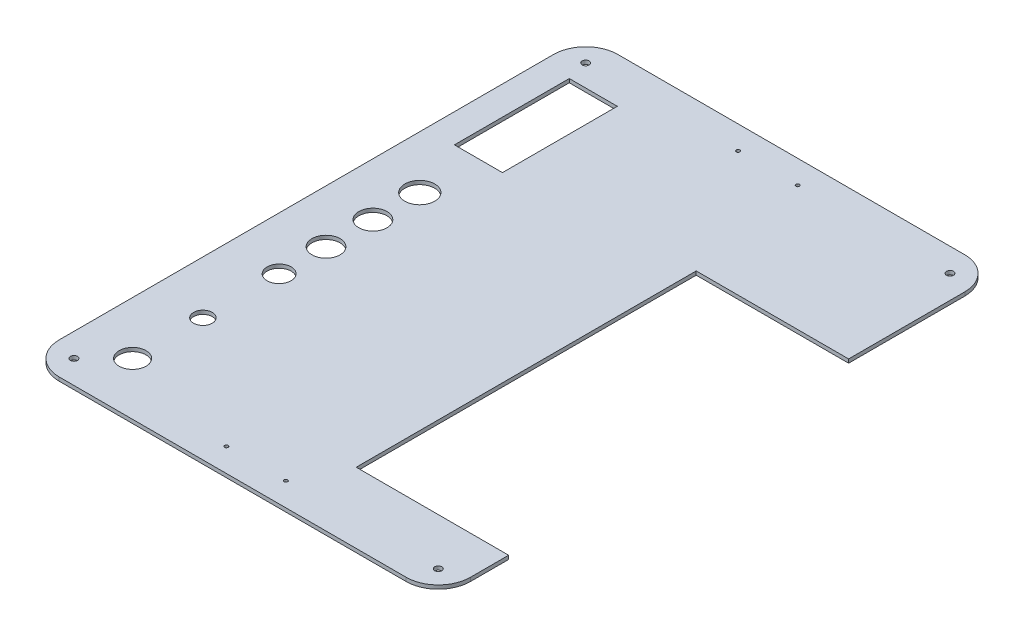
ISO-10303-21;
HEADER;
FILE_DESCRIPTION(('STEP AP214'),'2;1');
FILE_NAME('part.step','',(''),(''),'','','');
FILE_SCHEMA(('AUTOMOTIVE_DESIGN { 1 0 10303 214 1 1 1 1 }'));
ENDSEC;
DATA;
#1=APPLICATION_CONTEXT('core data for automotive mechanical design processes');
#2=APPLICATION_PROTOCOL_DEFINITION('international standard','automotive_design',2000,#1);
#3=PRODUCT_CONTEXT('',#1,'mechanical');
#4=PRODUCT('Part','Part','',(#3));
#5=PRODUCT_RELATED_PRODUCT_CATEGORY('part','',(#4));
#6=PRODUCT_DEFINITION_FORMATION('','',#4);
#7=PRODUCT_DEFINITION_CONTEXT('part definition',#1,'design');
#8=PRODUCT_DEFINITION('design','',#6,#7);
#9=PRODUCT_DEFINITION_SHAPE('','',#8);
#10=(LENGTH_UNIT() NAMED_UNIT(*) SI_UNIT(.MILLI.,.METRE.));
#11=(NAMED_UNIT(*) PLANE_ANGLE_UNIT() SI_UNIT($,.RADIAN.));
#12=(NAMED_UNIT(*) SI_UNIT($,.STERADIAN.) SOLID_ANGLE_UNIT());
#13=UNCERTAINTY_MEASURE_WITH_UNIT(LENGTH_MEASURE(1.E-05),#10,'distance_accuracy_value','');
#14=(GEOMETRIC_REPRESENTATION_CONTEXT(3) GLOBAL_UNCERTAINTY_ASSIGNED_CONTEXT((#13)) GLOBAL_UNIT_ASSIGNED_CONTEXT((#10,
#11,#12)) REPRESENTATION_CONTEXT('',''));
#15=CARTESIAN_POINT('',(0.,0.,0.));
#16=DIRECTION('',(0.,0.,1.));
#17=DIRECTION('',(1.,0.,0.));
#18=AXIS2_PLACEMENT_3D('',#15,#16,#17);
#19=CARTESIAN_POINT('',(175.387,3.175,-210.82));
#20=DIRECTION('',(-1.,0.,0.));
#21=DIRECTION('',(0.,0.,1.));
#22=AXIS2_PLACEMENT_3D('',#19,#20,#21);
#23=PLANE('',#22);
#24=DIRECTION('',(0.,0.,-1.));
#25=VECTOR('',#24,1.);
#26=CARTESIAN_POINT('',(175.387,0.,-210.82));
#27=LINE('',#26,#25);
#28=CARTESIAN_POINT('',(175.387,0.,210.82));
#29=VERTEX_POINT('',#28);
#30=CARTESIAN_POINT('',(175.387,0.,178.252));
#31=VERTEX_POINT('',#30);
#32=EDGE_CURVE('E280',#29,#31,#27,.T.);
#33=ORIENTED_EDGE('',*,*,#32,.T.);
#34=DIRECTION('',(0.,1.,0.));
#35=VECTOR('',#34,1.);
#36=CARTESIAN_POINT('',(175.387,-6.825,178.252));
#37=LINE('',#36,#35);
#38=CARTESIAN_POINT('',(175.387,3.175,178.252));
#39=VERTEX_POINT('',#38);
#40=EDGE_CURVE('E242',#31,#39,#37,.T.);
#41=ORIENTED_EDGE('',*,*,#40,.T.);
#42=DIRECTION('',(0.,0.,-1.));
#43=VECTOR('',#42,1.);
#44=CARTESIAN_POINT('',(175.387,3.175,-210.82));
#45=LINE('',#44,#43);
#46=CARTESIAN_POINT('',(175.387,3.175,210.82));
#47=VERTEX_POINT('',#46);
#48=EDGE_CURVE('E256',#47,#39,#45,.T.);
#49=ORIENTED_EDGE('',*,*,#48,.F.);
#50=DIRECTION('',(0.,-1.,0.));
#51=VECTOR('',#50,1.);
#52=CARTESIAN_POINT('',(175.387,3.175,210.82));
#53=LINE('',#52,#51);
#54=EDGE_CURVE('E313',#47,#29,#53,.T.);
#55=ORIENTED_EDGE('',*,*,#54,.T.);
#56=EDGE_LOOP('',(#33,#41,#49,#55));
#57=FACE_BOUND('',#56,.T.);
#58=ADVANCED_FACE('F39',(#57),#23,.F.);
#59=CARTESIAN_POINT('',(147.955,3.175,210.82));
#60=DIRECTION('',(0.,-1.,0.));
#61=DIRECTION('',(0.,0.,-1.));
#62=AXIS2_PLACEMENT_3D('',#59,#60,#61);
#63=CYLINDRICAL_SURFACE('',#62,27.432);
#64=CARTESIAN_POINT('',(147.955,0.,210.82));
#65=DIRECTION('',(0.,1.,0.));
#66=DIRECTION('',(0.,0.,1.));
#67=AXIS2_PLACEMENT_3D('',#64,#65,#66);
#68=CIRCLE('',#67,27.432);
#69=CARTESIAN_POINT('',(147.955,0.,238.252));
#70=VERTEX_POINT('',#69);
#71=EDGE_CURVE('E250',#70,#29,#68,.T.);
#72=ORIENTED_EDGE('',*,*,#71,.T.);
#73=ORIENTED_EDGE('',*,*,#54,.F.);
#74=CARTESIAN_POINT('',(147.955,3.175,210.82));
#75=DIRECTION('',(0.,1.,0.));
#76=DIRECTION('',(0.,0.,1.));
#77=AXIS2_PLACEMENT_3D('',#74,#75,#76);
#78=CIRCLE('',#77,27.432);
#79=CARTESIAN_POINT('',(147.955,3.175,238.252));
#80=VERTEX_POINT('',#79);
#81=EDGE_CURVE('E251',#80,#47,#78,.T.);
#82=ORIENTED_EDGE('',*,*,#81,.F.);
#83=DIRECTION('',(0.,-1.,0.));
#84=VECTOR('',#83,1.);
#85=CARTESIAN_POINT('',(147.955,3.175,238.252));
#86=LINE('',#85,#84);
#87=EDGE_CURVE('E272',#80,#70,#86,.T.);
#88=ORIENTED_EDGE('',*,*,#87,.T.);
#89=EDGE_LOOP('',(#72,#73,#82,#88));
#90=FACE_BOUND('',#89,.T.);
#91=ADVANCED_FACE('F41',(#90),#63,.T.);
#92=CARTESIAN_POINT('',(175.387,3.175,-111.748));
#93=VERTEX_POINT('',#92);
#94=CARTESIAN_POINT('',(175.387,3.175,-210.82));
#95=VERTEX_POINT('',#94);
#96=EDGE_CURVE('E258',#93,#95,#45,.T.);
#97=ORIENTED_EDGE('',*,*,#96,.F.);
#98=DIRECTION('',(0.,1.,0.));
#99=VECTOR('',#98,1.);
#100=CARTESIAN_POINT('',(175.387,-6.825,-111.748));
#101=LINE('',#100,#99);
#102=CARTESIAN_POINT('',(175.387,0.,-111.748));
#103=VERTEX_POINT('',#102);
#104=EDGE_CURVE('E241',#103,#93,#101,.T.);
#105=ORIENTED_EDGE('',*,*,#104,.F.);
#106=CARTESIAN_POINT('',(175.387,0.,-210.82));
#107=VERTEX_POINT('',#106);
#108=EDGE_CURVE('E277',#103,#107,#27,.T.);
#109=ORIENTED_EDGE('',*,*,#108,.T.);
#110=DIRECTION('',(0.,-1.,0.));
#111=VECTOR('',#110,1.);
#112=CARTESIAN_POINT('',(175.387,3.175,-210.82));
#113=LINE('',#112,#111);
#114=EDGE_CURVE('E306',#95,#107,#113,.T.);
#115=ORIENTED_EDGE('',*,*,#114,.F.);
#116=EDGE_LOOP('',(#97,#105,#109,#115));
#117=FACE_BOUND('',#116,.T.);
#118=ADVANCED_FACE('F366',(#117),#23,.F.);
#119=CARTESIAN_POINT('',(147.955,3.175,-210.82));
#120=DIRECTION('',(0.,-1.,0.));
#121=DIRECTION('',(0.,0.,-1.));
#122=AXIS2_PLACEMENT_3D('',#119,#120,#121);
#123=CYLINDRICAL_SURFACE('',#122,27.432);
#124=CARTESIAN_POINT('',(147.955,0.,-210.82));
#125=DIRECTION('',(0.,1.,0.));
#126=DIRECTION('',(0.,0.,-1.));
#127=AXIS2_PLACEMENT_3D('',#124,#125,#126);
#128=CIRCLE('',#127,27.432);
#129=CARTESIAN_POINT('',(147.955,0.,-238.252));
#130=VERTEX_POINT('',#129);
#131=EDGE_CURVE('E278',#107,#130,#128,.T.);
#132=ORIENTED_EDGE('',*,*,#131,.T.);
#133=DIRECTION('',(0.,-1.,0.));
#134=VECTOR('',#133,1.);
#135=CARTESIAN_POINT('',(147.955,3.175,-238.252));
#136=LINE('',#135,#134);
#137=CARTESIAN_POINT('',(147.955,3.175,-238.252));
#138=VERTEX_POINT('',#137);
#139=EDGE_CURVE('E304',#138,#130,#136,.T.);
#140=ORIENTED_EDGE('',*,*,#139,.F.);
#141=CARTESIAN_POINT('',(147.955,3.175,-210.82));
#142=DIRECTION('',(0.,1.,0.));
#143=DIRECTION('',(0.,0.,-1.));
#144=AXIS2_PLACEMENT_3D('',#141,#142,#143);
#145=CIRCLE('',#144,27.432);
#146=EDGE_CURVE('E261',#95,#138,#145,.T.);
#147=ORIENTED_EDGE('',*,*,#146,.F.);
#148=ORIENTED_EDGE('',*,*,#114,.T.);
#149=EDGE_LOOP('',(#132,#140,#147,#148));
#150=FACE_BOUND('',#149,.T.);
#151=ADVANCED_FACE('F361',(#150),#123,.T.);
#152=CARTESIAN_POINT('',(-147.955,3.175,-238.252));
#153=DIRECTION('',(0.,0.,1.));
#154=DIRECTION('',(1.,0.,0.));
#155=AXIS2_PLACEMENT_3D('',#152,#153,#154);
#156=PLANE('',#155);
#157=DIRECTION('',(-1.,0.,0.));
#158=VECTOR('',#157,1.);
#159=CARTESIAN_POINT('',(-147.955,0.,-238.252));
#160=LINE('',#159,#158);
#161=CARTESIAN_POINT('',(-147.955,0.,-238.252));
#162=VERTEX_POINT('',#161);
#163=EDGE_CURVE('E285',#130,#162,#160,.T.);
#164=ORIENTED_EDGE('',*,*,#163,.T.);
#165=DIRECTION('',(0.,-1.,0.));
#166=VECTOR('',#165,1.);
#167=CARTESIAN_POINT('',(-147.955,3.175,-238.252));
#168=LINE('',#167,#166);
#169=CARTESIAN_POINT('',(-147.955,3.175,-238.252));
#170=VERTEX_POINT('',#169);
#171=EDGE_CURVE('E305',#170,#162,#168,.T.);
#172=ORIENTED_EDGE('',*,*,#171,.F.);
#173=DIRECTION('',(-1.,0.,0.));
#174=VECTOR('',#173,1.);
#175=CARTESIAN_POINT('',(-147.955,3.175,-238.252));
#176=LINE('',#175,#174);
#177=EDGE_CURVE('E263',#138,#170,#176,.T.);
#178=ORIENTED_EDGE('',*,*,#177,.F.);
#179=ORIENTED_EDGE('',*,*,#139,.T.);
#180=EDGE_LOOP('',(#164,#172,#178,#179));
#181=FACE_BOUND('',#180,.T.);
#182=ADVANCED_FACE('F358',(#181),#156,.F.);
#183=CARTESIAN_POINT('',(-147.955,3.175,-210.82));
#184=DIRECTION('',(0.,-1.,0.));
#185=DIRECTION('',(0.,0.,-1.));
#186=AXIS2_PLACEMENT_3D('',#183,#184,#185);
#187=CYLINDRICAL_SURFACE('',#186,27.432);
#188=CARTESIAN_POINT('',(-147.955,0.,-210.82));
#189=DIRECTION('',(0.,1.,0.));
#190=DIRECTION('',(0.,0.,1.));
#191=AXIS2_PLACEMENT_3D('',#188,#189,#190);
#192=CIRCLE('',#191,27.432);
#193=CARTESIAN_POINT('',(-175.387,0.,-210.82));
#194=VERTEX_POINT('',#193);
#195=EDGE_CURVE('E282',#162,#194,#192,.T.);
#196=ORIENTED_EDGE('',*,*,#195,.T.);
#197=DIRECTION('',(0.,-1.,0.));
#198=VECTOR('',#197,1.);
#199=CARTESIAN_POINT('',(-175.387,3.175,-210.82));
#200=LINE('',#199,#198);
#201=CARTESIAN_POINT('',(-175.387,3.175,-210.82));
#202=VERTEX_POINT('',#201);
#203=EDGE_CURVE('E297',#202,#194,#200,.T.);
#204=ORIENTED_EDGE('',*,*,#203,.F.);
#205=CARTESIAN_POINT('',(-147.955,3.175,-210.82));
#206=DIRECTION('',(0.,1.,0.));
#207=DIRECTION('',(0.,0.,1.));
#208=AXIS2_PLACEMENT_3D('',#205,#206,#207);
#209=CIRCLE('',#208,27.432);
#210=EDGE_CURVE('E264',#170,#202,#209,.T.);
#211=ORIENTED_EDGE('',*,*,#210,.F.);
#212=ORIENTED_EDGE('',*,*,#171,.T.);
#213=EDGE_LOOP('',(#196,#204,#211,#212));
#214=FACE_BOUND('',#213,.T.);
#215=ADVANCED_FACE('F352',(#214),#187,.T.);
#216=CARTESIAN_POINT('',(-175.387,3.175,-210.82));
#217=DIRECTION('',(1.,0.,0.));
#218=DIRECTION('',(0.,0.,-1.));
#219=AXIS2_PLACEMENT_3D('',#216,#217,#218);
#220=PLANE('',#219);
#221=DIRECTION('',(0.,0.,1.));
#222=VECTOR('',#221,1.);
#223=CARTESIAN_POINT('',(-175.387,0.,-210.82));
#224=LINE('',#223,#222);
#225=CARTESIAN_POINT('',(-175.387,0.,210.82));
#226=VERTEX_POINT('',#225);
#227=EDGE_CURVE('E286',#194,#226,#224,.T.);
#228=ORIENTED_EDGE('',*,*,#227,.T.);
#229=DIRECTION('',(0.,-1.,0.));
#230=VECTOR('',#229,1.);
#231=CARTESIAN_POINT('',(-175.387,3.175,210.82));
#232=LINE('',#231,#230);
#233=CARTESIAN_POINT('',(-175.387,3.175,210.82));
#234=VERTEX_POINT('',#233);
#235=EDGE_CURVE('E298',#234,#226,#232,.T.);
#236=ORIENTED_EDGE('',*,*,#235,.F.);
#237=DIRECTION('',(0.,0.,1.));
#238=VECTOR('',#237,1.);
#239=CARTESIAN_POINT('',(-175.387,3.175,-210.82));
#240=LINE('',#239,#238);
#241=EDGE_CURVE('E270',#202,#234,#240,.T.);
#242=ORIENTED_EDGE('',*,*,#241,.F.);
#243=ORIENTED_EDGE('',*,*,#203,.T.);
#244=EDGE_LOOP('',(#228,#236,#242,#243));
#245=FACE_BOUND('',#244,.T.);
#246=ADVANCED_FACE('F346',(#245),#220,.F.);
#247=CARTESIAN_POINT('',(-147.955,3.175,210.82));
#248=DIRECTION('',(0.,-1.,0.));
#249=DIRECTION('',(0.,0.,-1.));
#250=AXIS2_PLACEMENT_3D('',#247,#248,#249);
#251=CYLINDRICAL_SURFACE('',#250,27.432);
#252=CARTESIAN_POINT('',(-147.955,0.,210.82));
#253=DIRECTION('',(0.,1.,0.));
#254=DIRECTION('',(0.,0.,1.));
#255=AXIS2_PLACEMENT_3D('',#252,#253,#254);
#256=CIRCLE('',#255,27.432);
#257=CARTESIAN_POINT('',(-147.955,0.,238.252));
#258=VERTEX_POINT('',#257);
#259=EDGE_CURVE('E287',#226,#258,#256,.T.);
#260=ORIENTED_EDGE('',*,*,#259,.T.);
#261=DIRECTION('',(0.,-1.,0.));
#262=VECTOR('',#261,1.);
#263=CARTESIAN_POINT('',(-147.955,3.175,238.252));
#264=LINE('',#263,#262);
#265=CARTESIAN_POINT('',(-147.955,3.175,238.252));
#266=VERTEX_POINT('',#265);
#267=EDGE_CURVE('E291',#266,#258,#264,.T.);
#268=ORIENTED_EDGE('',*,*,#267,.F.);
#269=CARTESIAN_POINT('',(-147.955,3.175,210.82));
#270=DIRECTION('',(0.,1.,0.));
#271=DIRECTION('',(0.,0.,1.));
#272=AXIS2_PLACEMENT_3D('',#269,#270,#271);
#273=CIRCLE('',#272,27.432);
#274=EDGE_CURVE('E267',#234,#266,#273,.T.);
#275=ORIENTED_EDGE('',*,*,#274,.F.);
#276=ORIENTED_EDGE('',*,*,#235,.T.);
#277=EDGE_LOOP('',(#260,#268,#275,#276));
#278=FACE_BOUND('',#277,.T.);
#279=ADVANCED_FACE('F343',(#278),#251,.T.);
#280=CARTESIAN_POINT('',(-147.955,3.175,238.252));
#281=DIRECTION('',(0.,0.,-1.));
#282=DIRECTION('',(-1.,0.,0.));
#283=AXIS2_PLACEMENT_3D('',#280,#281,#282);
#284=PLANE('',#283);
#285=DIRECTION('',(1.,0.,0.));
#286=VECTOR('',#285,1.);
#287=CARTESIAN_POINT('',(-147.955,0.,238.252));
#288=LINE('',#287,#286);
#289=EDGE_CURVE('E260',#258,#70,#288,.T.);
#290=ORIENTED_EDGE('',*,*,#289,.T.);
#291=ORIENTED_EDGE('',*,*,#87,.F.);
#292=DIRECTION('',(1.,0.,0.));
#293=VECTOR('',#292,1.);
#294=CARTESIAN_POINT('',(-147.955,3.175,238.252));
#295=LINE('',#294,#293);
#296=EDGE_CURVE('E271',#266,#80,#295,.T.);
#297=ORIENTED_EDGE('',*,*,#296,.F.);
#298=ORIENTED_EDGE('',*,*,#267,.T.);
#299=EDGE_LOOP('',(#290,#291,#297,#298));
#300=FACE_BOUND('',#299,.T.);
#301=ADVANCED_FACE('F339',(#300),#284,.F.);
#302=CARTESIAN_POINT('',(147.955,3.175,210.82));
#303=DIRECTION('',(0.,1.,0.));
#304=DIRECTION('',(0.,0.,1.));
#305=AXIS2_PLACEMENT_3D('',#302,#303,#304);
#306=PLANE('',#305);
#307=CARTESIAN_POINT('',(155.387,3.175,218.252));
#308=DIRECTION('',(0.,1.,0.));
#309=DIRECTION('',(0.,0.,1.));
#310=AXIS2_PLACEMENT_3D('',#307,#308,#309);
#311=CIRCLE('',#310,2.99999999999999);
#312=CARTESIAN_POINT('',(155.387,3.175,221.252));
#313=VERTEX_POINT('',#312);
#314=EDGE_CURVE('E199',#313,#313,#311,.T.);
#315=ORIENTED_EDGE('',*,*,#314,.F.);
#316=EDGE_LOOP('',(#315));
#317=FACE_BOUND('',#316,.T.);
#318=CARTESIAN_POINT('',(155.387,3.175,-218.252));
#319=DIRECTION('',(0.,1.,0.));
#320=DIRECTION('',(0.,0.,1.));
#321=AXIS2_PLACEMENT_3D('',#318,#319,#320);
#322=CIRCLE('',#321,2.99999999999999);
#323=CARTESIAN_POINT('',(155.387,3.175,-215.252));
#324=VERTEX_POINT('',#323);
#325=EDGE_CURVE('E193',#324,#324,#322,.T.);
#326=ORIENTED_EDGE('',*,*,#325,.F.);
#327=EDGE_LOOP('',(#326));
#328=FACE_BOUND('',#327,.T.);
#329=DIRECTION('',(0.,0.,-1.));
#330=VECTOR('',#329,1.);
#331=CARTESIAN_POINT('',(-109.887,3.175,-199.748));
#332=LINE('',#331,#330);
#333=CARTESIAN_POINT('',(-109.887,3.175,-101.748));
#334=VERTEX_POINT('',#333);
#335=CARTESIAN_POINT('',(-109.887,3.175,-199.748));
#336=VERTEX_POINT('',#335);
#337=EDGE_CURVE('E53',#334,#336,#332,.T.);
#338=ORIENTED_EDGE('',*,*,#337,.F.);
#339=DIRECTION('',(1.,0.,0.));
#340=VECTOR('',#339,1.);
#341=CARTESIAN_POINT('',(-150.887,3.175,-101.748));
#342=LINE('',#341,#340);
#343=CARTESIAN_POINT('',(-150.887,3.175,-101.748));
#344=VERTEX_POINT('',#343);
#345=EDGE_CURVE('E168',#344,#334,#342,.T.);
#346=ORIENTED_EDGE('',*,*,#345,.F.);
#347=DIRECTION('',(0.,0.,1.));
#348=VECTOR('',#347,1.);
#349=CARTESIAN_POINT('',(-150.887,3.175,-199.748));
#350=LINE('',#349,#348);
#351=CARTESIAN_POINT('',(-150.887,3.175,-199.748));
#352=VERTEX_POINT('',#351);
#353=EDGE_CURVE('E171',#352,#344,#350,.T.);
#354=ORIENTED_EDGE('',*,*,#353,.F.);
#355=DIRECTION('',(-1.,0.,0.));
#356=VECTOR('',#355,1.);
#357=CARTESIAN_POINT('',(-150.887,3.175,-199.748));
#358=LINE('',#357,#356);
#359=EDGE_CURVE('E185',#336,#352,#358,.T.);
#360=ORIENTED_EDGE('',*,*,#359,.F.);
#361=EDGE_LOOP('',(#338,#346,#354,#360));
#362=FACE_BOUND('',#361,.T.);
#363=CARTESIAN_POINT('',(-130.387,3.175,-51.7479999999999));
#364=DIRECTION('',(0.,1.,0.));
#365=DIRECTION('',(0.,0.,1.));
#366=AXIS2_PLACEMENT_3D('',#363,#364,#365);
#367=CIRCLE('',#366,12.7500000000001);
#368=CARTESIAN_POINT('',(-130.387,3.175,-38.9979999999998));
#369=VERTEX_POINT('',#368);
#370=EDGE_CURVE('E176',#369,#369,#367,.T.);
#371=ORIENTED_EDGE('',*,*,#370,.F.);
#372=EDGE_LOOP('',(#371));
#373=FACE_BOUND('',#372,.T.);
#374=CARTESIAN_POINT('',(-130.387,3.175,-11.7479999999999));
#375=DIRECTION('',(0.,1.,0.));
#376=DIRECTION('',(0.,0.,1.));
#377=AXIS2_PLACEMENT_3D('',#374,#375,#376);
#378=CIRCLE('',#377,12.);
#379=CARTESIAN_POINT('',(-130.387,3.175,0.252000000000101));
#380=VERTEX_POINT('',#379);
#381=EDGE_CURVE('E228',#380,#380,#378,.T.);
#382=ORIENTED_EDGE('',*,*,#381,.F.);
#383=EDGE_LOOP('',(#382));
#384=FACE_BOUND('',#383,.T.);
#385=CARTESIAN_POINT('',(-130.387,3.175,28.2520000000001));
#386=DIRECTION('',(0.,1.,0.));
#387=DIRECTION('',(0.,0.,1.));
#388=AXIS2_PLACEMENT_3D('',#385,#386,#387);
#389=CIRCLE('',#388,12.);
#390=CARTESIAN_POINT('',(-130.387,3.175,40.2520000000001));
#391=VERTEX_POINT('',#390);
#392=EDGE_CURVE('E219',#391,#391,#389,.T.);
#393=ORIENTED_EDGE('',*,*,#392,.F.);
#394=EDGE_LOOP('',(#393));
#395=FACE_BOUND('',#394,.T.);
#396=CARTESIAN_POINT('',(-130.387,3.175,68.2520000000001));
#397=DIRECTION('',(0.,1.,0.));
#398=DIRECTION('',(0.,0.,1.));
#399=AXIS2_PLACEMENT_3D('',#396,#397,#398);
#400=CIRCLE('',#399,10.25);
#401=CARTESIAN_POINT('',(-130.387,3.175,78.5020000000001));
#402=VERTEX_POINT('',#401);
#403=EDGE_CURVE('E212',#402,#402,#400,.T.);
#404=ORIENTED_EDGE('',*,*,#403,.F.);
#405=EDGE_LOOP('',(#404));
#406=FACE_BOUND('',#405,.T.);
#407=CARTESIAN_POINT('',(-130.387,3.175,133.252));
#408=DIRECTION('',(0.,1.,0.));
#409=DIRECTION('',(0.,0.,1.));
#410=AXIS2_PLACEMENT_3D('',#407,#408,#409);
#411=CIRCLE('',#410,7.99999999999999);
#412=CARTESIAN_POINT('',(-130.387,3.175,141.252));
#413=VERTEX_POINT('',#412);
#414=EDGE_CURVE('E208',#413,#413,#411,.T.);
#415=ORIENTED_EDGE('',*,*,#414,.F.);
#416=EDGE_LOOP('',(#415));
#417=FACE_BOUND('',#416,.T.);
#418=CARTESIAN_POINT('',(25.4,3.175,218.252));
#419=DIRECTION('',(0.,1.,0.));
#420=DIRECTION('',(0.,0.,1.));
#421=AXIS2_PLACEMENT_3D('',#418,#419,#420);
#422=CIRCLE('',#421,1.5);
#423=CARTESIAN_POINT('',(25.4,3.175,219.752));
#424=VERTEX_POINT('',#423);
#425=EDGE_CURVE('E433',#424,#424,#422,.T.);
#426=ORIENTED_EDGE('',*,*,#425,.F.);
#427=EDGE_LOOP('',(#426));
#428=FACE_BOUND('',#427,.T.);
#429=CARTESIAN_POINT('',(-25.4,3.175,218.252));
#430=DIRECTION('',(0.,1.,0.));
#431=DIRECTION('',(0.,0.,1.));
#432=AXIS2_PLACEMENT_3D('',#429,#430,#431);
#433=CIRCLE('',#432,1.5);
#434=CARTESIAN_POINT('',(-25.4,3.175,219.752));
#435=VERTEX_POINT('',#434);
#436=EDGE_CURVE('E440',#435,#435,#433,.T.);
#437=ORIENTED_EDGE('',*,*,#436,.F.);
#438=EDGE_LOOP('',(#437));
#439=FACE_BOUND('',#438,.T.);
#440=CARTESIAN_POINT('',(25.4,3.175,-218.252));
#441=DIRECTION('',(0.,1.,0.));
#442=DIRECTION('',(0.,0.,1.));
#443=AXIS2_PLACEMENT_3D('',#440,#441,#442);
#444=CIRCLE('',#443,1.5);
#445=CARTESIAN_POINT('',(25.4,3.175,-216.752));
#446=VERTEX_POINT('',#445);
#447=EDGE_CURVE('E442',#446,#446,#444,.T.);
#448=ORIENTED_EDGE('',*,*,#447,.F.);
#449=EDGE_LOOP('',(#448));
#450=FACE_BOUND('',#449,.T.);
#451=CARTESIAN_POINT('',(-25.4,3.175,-218.252));
#452=DIRECTION('',(0.,1.,0.));
#453=DIRECTION('',(0.,0.,1.));
#454=AXIS2_PLACEMENT_3D('',#451,#452,#453);
#455=CIRCLE('',#454,1.5);
#456=CARTESIAN_POINT('',(-25.4,3.175,-216.752));
#457=VERTEX_POINT('',#456);
#458=EDGE_CURVE('E443',#457,#457,#455,.T.);
#459=ORIENTED_EDGE('',*,*,#458,.F.);
#460=EDGE_LOOP('',(#459));
#461=FACE_BOUND('',#460,.T.);
#462=CARTESIAN_POINT('',(-155.387,3.175,-218.252));
#463=DIRECTION('',(0.,1.,0.));
#464=DIRECTION('',(0.,0.,1.));
#465=AXIS2_PLACEMENT_3D('',#462,#463,#464);
#466=CIRCLE('',#465,2.99999999999999);
#467=CARTESIAN_POINT('',(-155.387,3.175,-215.252));
#468=VERTEX_POINT('',#467);
#469=EDGE_CURVE('E447',#468,#468,#466,.T.);
#470=ORIENTED_EDGE('',*,*,#469,.F.);
#471=EDGE_LOOP('',(#470));
#472=FACE_BOUND('',#471,.T.);
#473=CARTESIAN_POINT('',(-155.387,3.175,218.252));
#474=DIRECTION('',(0.,1.,0.));
#475=DIRECTION('',(0.,0.,1.));
#476=AXIS2_PLACEMENT_3D('',#473,#474,#475);
#477=CIRCLE('',#476,2.99999999999999);
#478=CARTESIAN_POINT('',(-155.387,3.175,221.252));
#479=VERTEX_POINT('',#478);
#480=EDGE_CURVE('E452',#479,#479,#477,.T.);
#481=ORIENTED_EDGE('',*,*,#480,.F.);
#482=EDGE_LOOP('',(#481));
#483=FACE_BOUND('',#482,.T.);
#484=CARTESIAN_POINT('',(-130.387,3.175,193.252));
#485=DIRECTION('',(0.,1.,0.));
#486=DIRECTION('',(0.,0.,1.));
#487=AXIS2_PLACEMENT_3D('',#484,#485,#486);
#488=CIRCLE('',#487,11.5);
#489=CARTESIAN_POINT('',(-130.387,3.175,204.752));
#490=VERTEX_POINT('',#489);
#491=EDGE_CURVE('E210',#490,#490,#488,.T.);
#492=ORIENTED_EDGE('',*,*,#491,.F.);
#493=EDGE_LOOP('',(#492));
#494=FACE_BOUND('',#493,.T.);
#495=DIRECTION('',(1.,0.,0.));
#496=VECTOR('',#495,1.);
#497=CARTESIAN_POINT('',(45.3870000000001,3.175,178.252));
#498=LINE('',#497,#496);
#499=CARTESIAN_POINT('',(45.3870000000001,3.175,178.252));
#500=VERTEX_POINT('',#499);
#501=EDGE_CURVE('E243',#500,#39,#498,.T.);
#502=ORIENTED_EDGE('',*,*,#501,.F.);
#503=DIRECTION('',(0.,0.,1.));
#504=VECTOR('',#503,1.);
#505=CARTESIAN_POINT('',(45.387,3.175,-111.748));
#506=LINE('',#505,#504);
#507=CARTESIAN_POINT('',(45.387,3.175,-111.748));
#508=VERTEX_POINT('',#507);
#509=EDGE_CURVE('E236',#508,#500,#506,.T.);
#510=ORIENTED_EDGE('',*,*,#509,.F.);
#511=DIRECTION('',(-1.,0.,0.));
#512=VECTOR('',#511,1.);
#513=CARTESIAN_POINT('',(175.387,3.175,-111.748));
#514=LINE('',#513,#512);
#515=EDGE_CURVE('E232',#93,#508,#514,.T.);
#516=ORIENTED_EDGE('',*,*,#515,.F.);
#517=ORIENTED_EDGE('',*,*,#96,.T.);
#518=ORIENTED_EDGE('',*,*,#146,.T.);
#519=ORIENTED_EDGE('',*,*,#177,.T.);
#520=ORIENTED_EDGE('',*,*,#210,.T.);
#521=ORIENTED_EDGE('',*,*,#241,.T.);
#522=ORIENTED_EDGE('',*,*,#274,.T.);
#523=ORIENTED_EDGE('',*,*,#296,.T.);
#524=ORIENTED_EDGE('',*,*,#81,.T.);
#525=ORIENTED_EDGE('',*,*,#48,.T.);
#526=EDGE_LOOP('',(#502,#510,#516,#517,#518,#519,#520,#521,#522,#523,#524,#525));
#527=FACE_BOUND('',#526,.T.);
#528=ADVANCED_FACE('F328',(#317,#328,#362,#373,#384,#395,#406,#417,#428,#439,#450,#461,#472,
#483,#494,#527),#306,.T.);
#529=CARTESIAN_POINT('',(147.955,0.,210.82));
#530=DIRECTION('',(0.,1.,0.));
#531=DIRECTION('',(0.,0.,1.));
#532=AXIS2_PLACEMENT_3D('',#529,#530,#531);
#533=PLANE('',#532);
#534=CARTESIAN_POINT('',(155.387,0.,218.252));
#535=DIRECTION('',(0.,1.,0.));
#536=DIRECTION('',(0.,0.,1.));
#537=AXIS2_PLACEMENT_3D('',#534,#535,#536);
#538=CIRCLE('',#537,2.99999999999999);
#539=CARTESIAN_POINT('',(155.387,0.,221.252));
#540=VERTEX_POINT('',#539);
#541=EDGE_CURVE('E197',#540,#540,#538,.T.);
#542=ORIENTED_EDGE('',*,*,#541,.T.);
#543=EDGE_LOOP('',(#542));
#544=FACE_BOUND('',#543,.T.);
#545=CARTESIAN_POINT('',(155.387,0.,-218.252));
#546=DIRECTION('',(0.,1.,0.));
#547=DIRECTION('',(0.,0.,1.));
#548=AXIS2_PLACEMENT_3D('',#545,#546,#547);
#549=CIRCLE('',#548,2.99999999999999);
#550=CARTESIAN_POINT('',(155.387,0.,-215.252));
#551=VERTEX_POINT('',#550);
#552=EDGE_CURVE('E181',#551,#551,#549,.T.);
#553=ORIENTED_EDGE('',*,*,#552,.T.);
#554=EDGE_LOOP('',(#553));
#555=FACE_BOUND('',#554,.T.);
#556=DIRECTION('',(1.,0.,0.));
#557=VECTOR('',#556,1.);
#558=CARTESIAN_POINT('',(-150.887,0.,-101.748));
#559=LINE('',#558,#557);
#560=CARTESIAN_POINT('',(-150.887,0.,-101.748));
#561=VERTEX_POINT('',#560);
#562=CARTESIAN_POINT('',(-109.887,0.,-101.748));
#563=VERTEX_POINT('',#562);
#564=EDGE_CURVE('E159',#561,#563,#559,.T.);
#565=ORIENTED_EDGE('',*,*,#564,.T.);
#566=DIRECTION('',(0.,0.,-1.));
#567=VECTOR('',#566,1.);
#568=CARTESIAN_POINT('',(-109.887,0.,-199.748));
#569=LINE('',#568,#567);
#570=CARTESIAN_POINT('',(-109.887,0.,-199.748));
#571=VERTEX_POINT('',#570);
#572=EDGE_CURVE('E152',#563,#571,#569,.T.);
#573=ORIENTED_EDGE('',*,*,#572,.T.);
#574=DIRECTION('',(-1.,0.,0.));
#575=VECTOR('',#574,1.);
#576=CARTESIAN_POINT('',(-150.887,0.,-199.748));
#577=LINE('',#576,#575);
#578=CARTESIAN_POINT('',(-150.887,0.,-199.748));
#579=VERTEX_POINT('',#578);
#580=EDGE_CURVE('E162',#571,#579,#577,.T.);
#581=ORIENTED_EDGE('',*,*,#580,.T.);
#582=DIRECTION('',(0.,0.,1.));
#583=VECTOR('',#582,1.);
#584=CARTESIAN_POINT('',(-150.887,0.,-199.748));
#585=LINE('',#584,#583);
#586=EDGE_CURVE('E65',#579,#561,#585,.T.);
#587=ORIENTED_EDGE('',*,*,#586,.T.);
#588=EDGE_LOOP('',(#565,#573,#581,#587));
#589=FACE_BOUND('',#588,.T.);
#590=CARTESIAN_POINT('',(-130.387,0.,-51.7479999999999));
#591=DIRECTION('',(0.,1.,0.));
#592=DIRECTION('',(0.,0.,1.));
#593=AXIS2_PLACEMENT_3D('',#590,#591,#592);
#594=CIRCLE('',#593,12.7500000000001);
#595=CARTESIAN_POINT('',(-130.387,0.,-38.9979999999998));
#596=VERTEX_POINT('',#595);
#597=EDGE_CURVE('E227',#596,#596,#594,.T.);
#598=ORIENTED_EDGE('',*,*,#597,.T.);
#599=EDGE_LOOP('',(#598));
#600=FACE_BOUND('',#599,.T.);
#601=CARTESIAN_POINT('',(-130.387,0.,-11.7479999999999));
#602=DIRECTION('',(0.,1.,0.));
#603=DIRECTION('',(0.,0.,1.));
#604=AXIS2_PLACEMENT_3D('',#601,#602,#603);
#605=CIRCLE('',#604,12.);
#606=CARTESIAN_POINT('',(-130.387,0.,0.252000000000101));
#607=VERTEX_POINT('',#606);
#608=EDGE_CURVE('E224',#607,#607,#605,.T.);
#609=ORIENTED_EDGE('',*,*,#608,.T.);
#610=EDGE_LOOP('',(#609));
#611=FACE_BOUND('',#610,.T.);
#612=CARTESIAN_POINT('',(-130.387,0.,28.2520000000001));
#613=DIRECTION('',(0.,1.,0.));
#614=DIRECTION('',(0.,0.,1.));
#615=AXIS2_PLACEMENT_3D('',#612,#613,#614);
#616=CIRCLE('',#615,12.);
#617=CARTESIAN_POINT('',(-130.387,0.,40.2520000000001));
#618=VERTEX_POINT('',#617);
#619=EDGE_CURVE('E220',#618,#618,#616,.T.);
#620=ORIENTED_EDGE('',*,*,#619,.T.);
#621=EDGE_LOOP('',(#620));
#622=FACE_BOUND('',#621,.T.);
#623=CARTESIAN_POINT('',(-130.387,0.,68.2520000000001));
#624=DIRECTION('',(0.,1.,0.));
#625=DIRECTION('',(0.,0.,1.));
#626=AXIS2_PLACEMENT_3D('',#623,#624,#625);
#627=CIRCLE('',#626,10.25);
#628=CARTESIAN_POINT('',(-130.387,0.,78.5020000000001));
#629=VERTEX_POINT('',#628);
#630=EDGE_CURVE('E211',#629,#629,#627,.T.);
#631=ORIENTED_EDGE('',*,*,#630,.T.);
#632=EDGE_LOOP('',(#631));
#633=FACE_BOUND('',#632,.T.);
#634=CARTESIAN_POINT('',(-130.387,0.,133.252));
#635=DIRECTION('',(0.,1.,0.));
#636=DIRECTION('',(0.,0.,1.));
#637=AXIS2_PLACEMENT_3D('',#634,#635,#636);
#638=CIRCLE('',#637,7.99999999999999);
#639=CARTESIAN_POINT('',(-130.387,0.,141.252));
#640=VERTEX_POINT('',#639);
#641=EDGE_CURVE('E204',#640,#640,#638,.T.);
#642=ORIENTED_EDGE('',*,*,#641,.T.);
#643=EDGE_LOOP('',(#642));
#644=FACE_BOUND('',#643,.T.);
#645=CARTESIAN_POINT('',(25.4,0.,218.252));
#646=DIRECTION('',(0.,1.,0.));
#647=DIRECTION('',(0.,0.,1.));
#648=AXIS2_PLACEMENT_3D('',#645,#646,#647);
#649=CIRCLE('',#648,1.5);
#650=CARTESIAN_POINT('',(25.4,0.,219.752));
#651=VERTEX_POINT('',#650);
#652=EDGE_CURVE('E623',#651,#651,#649,.T.);
#653=ORIENTED_EDGE('',*,*,#652,.T.);
#654=EDGE_LOOP('',(#653));
#655=FACE_BOUND('',#654,.T.);
#656=CARTESIAN_POINT('',(-25.4,0.,218.252));
#657=DIRECTION('',(0.,1.,0.));
#658=DIRECTION('',(0.,0.,1.));
#659=AXIS2_PLACEMENT_3D('',#656,#657,#658);
#660=CIRCLE('',#659,1.5);
#661=CARTESIAN_POINT('',(-25.4,0.,219.752));
#662=VERTEX_POINT('',#661);
#663=EDGE_CURVE('E471',#662,#662,#660,.T.);
#664=ORIENTED_EDGE('',*,*,#663,.T.);
#665=EDGE_LOOP('',(#664));
#666=FACE_BOUND('',#665,.T.);
#667=CARTESIAN_POINT('',(25.4,0.,-218.252));
#668=DIRECTION('',(0.,1.,0.));
#669=DIRECTION('',(0.,0.,1.));
#670=AXIS2_PLACEMENT_3D('',#667,#668,#669);
#671=CIRCLE('',#670,1.5);
#672=CARTESIAN_POINT('',(25.4,0.,-216.752));
#673=VERTEX_POINT('',#672);
#674=EDGE_CURVE('E469',#673,#673,#671,.T.);
#675=ORIENTED_EDGE('',*,*,#674,.T.);
#676=EDGE_LOOP('',(#675));
#677=FACE_BOUND('',#676,.T.);
#678=CARTESIAN_POINT('',(-25.4,0.,-218.252));
#679=DIRECTION('',(0.,1.,0.));
#680=DIRECTION('',(0.,0.,1.));
#681=AXIS2_PLACEMENT_3D('',#678,#679,#680);
#682=CIRCLE('',#681,1.5);
#683=CARTESIAN_POINT('',(-25.4,0.,-216.752));
#684=VERTEX_POINT('',#683);
#685=EDGE_CURVE('E466',#684,#684,#682,.T.);
#686=ORIENTED_EDGE('',*,*,#685,.T.);
#687=EDGE_LOOP('',(#686));
#688=FACE_BOUND('',#687,.T.);
#689=CARTESIAN_POINT('',(-155.387,0.,-218.252));
#690=DIRECTION('',(0.,1.,0.));
#691=DIRECTION('',(0.,0.,1.));
#692=AXIS2_PLACEMENT_3D('',#689,#690,#691);
#693=CIRCLE('',#692,2.99999999999999);
#694=CARTESIAN_POINT('',(-155.387,0.,-215.252));
#695=VERTEX_POINT('',#694);
#696=EDGE_CURVE('E460',#695,#695,#693,.T.);
#697=ORIENTED_EDGE('',*,*,#696,.T.);
#698=EDGE_LOOP('',(#697));
#699=FACE_BOUND('',#698,.T.);
#700=CARTESIAN_POINT('',(-155.387,0.,218.252));
#701=DIRECTION('',(0.,1.,0.));
#702=DIRECTION('',(0.,0.,1.));
#703=AXIS2_PLACEMENT_3D('',#700,#701,#702);
#704=CIRCLE('',#703,2.99999999999999);
#705=CARTESIAN_POINT('',(-155.387,0.,221.252));
#706=VERTEX_POINT('',#705);
#707=EDGE_CURVE('E201',#706,#706,#704,.T.);
#708=ORIENTED_EDGE('',*,*,#707,.T.);
#709=EDGE_LOOP('',(#708));
#710=FACE_BOUND('',#709,.T.);
#711=CARTESIAN_POINT('',(-130.387,0.,193.252));
#712=DIRECTION('',(0.,1.,0.));
#713=DIRECTION('',(0.,0.,1.));
#714=AXIS2_PLACEMENT_3D('',#711,#712,#713);
#715=CIRCLE('',#714,11.5);
#716=CARTESIAN_POINT('',(-130.387,0.,204.752));
#717=VERTEX_POINT('',#716);
#718=EDGE_CURVE('E229',#717,#717,#715,.T.);
#719=ORIENTED_EDGE('',*,*,#718,.T.);
#720=EDGE_LOOP('',(#719));
#721=FACE_BOUND('',#720,.T.);
#722=DIRECTION('',(0.,0.,1.));
#723=VECTOR('',#722,1.);
#724=CARTESIAN_POINT('',(45.3870000000001,0.,210.82));
#725=LINE('',#724,#723);
#726=CARTESIAN_POINT('',(45.387,0.,-111.748));
#727=VERTEX_POINT('',#726);
#728=CARTESIAN_POINT('',(45.3870000000001,0.,178.252));
#729=VERTEX_POINT('',#728);
#730=EDGE_CURVE('E50',#727,#729,#725,.T.);
#731=ORIENTED_EDGE('',*,*,#730,.T.);
#732=DIRECTION('',(1.,0.,0.));
#733=VECTOR('',#732,1.);
#734=CARTESIAN_POINT('',(147.955,0.,178.252));
#735=LINE('',#734,#733);
#736=EDGE_CURVE('E11',#729,#31,#735,.T.);
#737=ORIENTED_EDGE('',*,*,#736,.T.);
#738=ORIENTED_EDGE('',*,*,#32,.F.);
#739=ORIENTED_EDGE('',*,*,#71,.F.);
#740=ORIENTED_EDGE('',*,*,#289,.F.);
#741=ORIENTED_EDGE('',*,*,#259,.F.);
#742=ORIENTED_EDGE('',*,*,#227,.F.);
#743=ORIENTED_EDGE('',*,*,#195,.F.);
#744=ORIENTED_EDGE('',*,*,#163,.F.);
#745=ORIENTED_EDGE('',*,*,#131,.F.);
#746=ORIENTED_EDGE('',*,*,#108,.F.);
#747=DIRECTION('',(-1.,0.,0.));
#748=VECTOR('',#747,1.);
#749=CARTESIAN_POINT('',(147.955,0.,-111.748));
#750=LINE('',#749,#748);
#751=EDGE_CURVE('E314',#103,#727,#750,.T.);
#752=ORIENTED_EDGE('',*,*,#751,.T.);
#753=EDGE_LOOP('',(#731,#737,#738,#739,#740,#741,#742,#743,#744,#745,#746,#752));
#754=FACE_BOUND('',#753,.T.);
#755=ADVANCED_FACE('F170',(#544,#555,#589,#600,#611,#622,#633,#644,#655,#666,#677,#688,#699,
#710,#721,#754),#533,.F.);
#756=CARTESIAN_POINT('',(45.3870000000001,-6.825,178.252));
#757=DIRECTION('',(0.,0.,1.));
#758=DIRECTION('',(1.,0.,0.));
#759=AXIS2_PLACEMENT_3D('',#756,#757,#758);
#760=PLANE('',#759);
#761=DIRECTION('',(0.,1.,0.));
#762=VECTOR('',#761,1.);
#763=CARTESIAN_POINT('',(45.3870000000001,-6.825,178.252));
#764=LINE('',#763,#762);
#765=EDGE_CURVE('E247',#729,#500,#764,.T.);
#766=ORIENTED_EDGE('',*,*,#765,.T.);
#767=ORIENTED_EDGE('',*,*,#501,.T.);
#768=ORIENTED_EDGE('',*,*,#40,.F.);
#769=ORIENTED_EDGE('',*,*,#736,.F.);
#770=EDGE_LOOP('',(#766,#767,#768,#769));
#771=FACE_BOUND('',#770,.T.);
#772=ADVANCED_FACE('F326',(#771),#760,.F.);
#773=CARTESIAN_POINT('',(45.387,-6.825,-111.748));
#774=DIRECTION('',(-1.,0.,0.));
#775=DIRECTION('',(0.,0.,1.));
#776=AXIS2_PLACEMENT_3D('',#773,#774,#775);
#777=PLANE('',#776);
#778=DIRECTION('',(0.,1.,0.));
#779=VECTOR('',#778,1.);
#780=CARTESIAN_POINT('',(45.387,-6.825,-111.748));
#781=LINE('',#780,#779);
#782=EDGE_CURVE('E249',#727,#508,#781,.T.);
#783=ORIENTED_EDGE('',*,*,#782,.T.);
#784=ORIENTED_EDGE('',*,*,#509,.T.);
#785=ORIENTED_EDGE('',*,*,#765,.F.);
#786=ORIENTED_EDGE('',*,*,#730,.F.);
#787=EDGE_LOOP('',(#783,#784,#785,#786));
#788=FACE_BOUND('',#787,.T.);
#789=ADVANCED_FACE('F325',(#788),#777,.F.);
#790=CARTESIAN_POINT('',(175.387,-6.825,-111.748));
#791=DIRECTION('',(0.,0.,-1.));
#792=DIRECTION('',(-1.,0.,0.));
#793=AXIS2_PLACEMENT_3D('',#790,#791,#792);
#794=PLANE('',#793);
#795=ORIENTED_EDGE('',*,*,#104,.T.);
#796=ORIENTED_EDGE('',*,*,#515,.T.);
#797=ORIENTED_EDGE('',*,*,#782,.F.);
#798=ORIENTED_EDGE('',*,*,#751,.F.);
#799=EDGE_LOOP('',(#795,#796,#797,#798));
#800=FACE_BOUND('',#799,.T.);
#801=ADVANCED_FACE('F371',(#800),#794,.F.);
#802=CARTESIAN_POINT('',(-130.387,0.,193.252));
#803=DIRECTION('',(0.,1.,0.));
#804=DIRECTION('',(0.,0.,1.));
#805=AXIS2_PLACEMENT_3D('',#802,#803,#804);
#806=CYLINDRICAL_SURFACE('',#805,11.5);
#807=ORIENTED_EDGE('',*,*,#718,.F.);
#808=EDGE_LOOP('',(#807));
#809=FACE_BOUND('',#808,.T.);
#810=ORIENTED_EDGE('',*,*,#491,.T.);
#811=EDGE_LOOP('',(#810));
#812=FACE_BOUND('',#811,.T.);
#813=ADVANCED_FACE('F373',(#809,#812),#806,.F.);
#814=CARTESIAN_POINT('',(-155.387,0.,218.252));
#815=DIRECTION('',(0.,1.,0.));
#816=DIRECTION('',(0.,0.,1.));
#817=AXIS2_PLACEMENT_3D('',#814,#815,#816);
#818=CYLINDRICAL_SURFACE('',#817,2.99999999999999);
#819=ORIENTED_EDGE('',*,*,#707,.F.);
#820=EDGE_LOOP('',(#819));
#821=FACE_BOUND('',#820,.T.);
#822=ORIENTED_EDGE('',*,*,#480,.T.);
#823=EDGE_LOOP('',(#822));
#824=FACE_BOUND('',#823,.T.);
#825=ADVANCED_FACE('F379',(#821,#824),#818,.F.);
#826=CARTESIAN_POINT('',(-155.387,0.,-218.252));
#827=DIRECTION('',(0.,1.,0.));
#828=DIRECTION('',(0.,0.,1.));
#829=AXIS2_PLACEMENT_3D('',#826,#827,#828);
#830=CYLINDRICAL_SURFACE('',#829,2.99999999999999);
#831=ORIENTED_EDGE('',*,*,#696,.F.);
#832=EDGE_LOOP('',(#831));
#833=FACE_BOUND('',#832,.T.);
#834=ORIENTED_EDGE('',*,*,#469,.T.);
#835=EDGE_LOOP('',(#834));
#836=FACE_BOUND('',#835,.T.);
#837=ADVANCED_FACE('F545',(#833,#836),#830,.F.);
#838=CARTESIAN_POINT('',(-25.4,0.,-218.252));
#839=DIRECTION('',(0.,1.,0.));
#840=DIRECTION('',(0.,0.,1.));
#841=AXIS2_PLACEMENT_3D('',#838,#839,#840);
#842=CYLINDRICAL_SURFACE('',#841,1.5);
#843=ORIENTED_EDGE('',*,*,#685,.F.);
#844=EDGE_LOOP('',(#843));
#845=FACE_BOUND('',#844,.T.);
#846=ORIENTED_EDGE('',*,*,#458,.T.);
#847=EDGE_LOOP('',(#846));
#848=FACE_BOUND('',#847,.T.);
#849=ADVANCED_FACE('F549',(#845,#848),#842,.F.);
#850=CARTESIAN_POINT('',(25.4,0.,-218.252));
#851=DIRECTION('',(0.,1.,0.));
#852=DIRECTION('',(0.,0.,1.));
#853=AXIS2_PLACEMENT_3D('',#850,#851,#852);
#854=CYLINDRICAL_SURFACE('',#853,1.5);
#855=ORIENTED_EDGE('',*,*,#674,.F.);
#856=EDGE_LOOP('',(#855));
#857=FACE_BOUND('',#856,.T.);
#858=ORIENTED_EDGE('',*,*,#447,.T.);
#859=EDGE_LOOP('',(#858));
#860=FACE_BOUND('',#859,.T.);
#861=ADVANCED_FACE('F492',(#857,#860),#854,.F.);
#862=CARTESIAN_POINT('',(-25.4,0.,218.252));
#863=DIRECTION('',(0.,1.,0.));
#864=DIRECTION('',(0.,0.,1.));
#865=AXIS2_PLACEMENT_3D('',#862,#863,#864);
#866=CYLINDRICAL_SURFACE('',#865,1.5);
#867=ORIENTED_EDGE('',*,*,#663,.F.);
#868=EDGE_LOOP('',(#867));
#869=FACE_BOUND('',#868,.T.);
#870=ORIENTED_EDGE('',*,*,#436,.T.);
#871=EDGE_LOOP('',(#870));
#872=FACE_BOUND('',#871,.T.);
#873=ADVANCED_FACE('F563',(#869,#872),#866,.F.);
#874=CARTESIAN_POINT('',(25.4,0.,218.252));
#875=DIRECTION('',(0.,1.,0.));
#876=DIRECTION('',(0.,0.,1.));
#877=AXIS2_PLACEMENT_3D('',#874,#875,#876);
#878=CYLINDRICAL_SURFACE('',#877,1.5);
#879=ORIENTED_EDGE('',*,*,#652,.F.);
#880=EDGE_LOOP('',(#879));
#881=FACE_BOUND('',#880,.T.);
#882=ORIENTED_EDGE('',*,*,#425,.T.);
#883=EDGE_LOOP('',(#882));
#884=FACE_BOUND('',#883,.T.);
#885=ADVANCED_FACE('F513',(#881,#884),#878,.F.);
#886=CARTESIAN_POINT('',(-130.387,0.,133.252));
#887=DIRECTION('',(0.,1.,0.));
#888=DIRECTION('',(0.,0.,1.));
#889=AXIS2_PLACEMENT_3D('',#886,#887,#888);
#890=CYLINDRICAL_SURFACE('',#889,7.99999999999999);
#891=ORIENTED_EDGE('',*,*,#641,.F.);
#892=EDGE_LOOP('',(#891));
#893=FACE_BOUND('',#892,.T.);
#894=ORIENTED_EDGE('',*,*,#414,.T.);
#895=EDGE_LOOP('',(#894));
#896=FACE_BOUND('',#895,.T.);
#897=ADVANCED_FACE('F512',(#893,#896),#890,.F.);
#898=CARTESIAN_POINT('',(-130.387,0.,68.2520000000001));
#899=DIRECTION('',(0.,1.,0.));
#900=DIRECTION('',(0.,0.,1.));
#901=AXIS2_PLACEMENT_3D('',#898,#899,#900);
#902=CYLINDRICAL_SURFACE('',#901,10.25);
#903=ORIENTED_EDGE('',*,*,#630,.F.);
#904=EDGE_LOOP('',(#903));
#905=FACE_BOUND('',#904,.T.);
#906=ORIENTED_EDGE('',*,*,#403,.T.);
#907=EDGE_LOOP('',(#906));
#908=FACE_BOUND('',#907,.T.);
#909=ADVANCED_FACE('F514',(#905,#908),#902,.F.);
#910=CARTESIAN_POINT('',(-130.387,0.,28.2520000000001));
#911=DIRECTION('',(0.,1.,0.));
#912=DIRECTION('',(0.,0.,1.));
#913=AXIS2_PLACEMENT_3D('',#910,#911,#912);
#914=CYLINDRICAL_SURFACE('',#913,12.);
#915=ORIENTED_EDGE('',*,*,#619,.F.);
#916=EDGE_LOOP('',(#915));
#917=FACE_BOUND('',#916,.T.);
#918=ORIENTED_EDGE('',*,*,#392,.T.);
#919=EDGE_LOOP('',(#918));
#920=FACE_BOUND('',#919,.T.);
#921=ADVANCED_FACE('F488',(#917,#920),#914,.F.);
#922=CARTESIAN_POINT('',(-130.387,0.,-11.7479999999999));
#923=DIRECTION('',(0.,1.,0.));
#924=DIRECTION('',(0.,0.,1.));
#925=AXIS2_PLACEMENT_3D('',#922,#923,#924);
#926=CYLINDRICAL_SURFACE('',#925,12.);
#927=ORIENTED_EDGE('',*,*,#608,.F.);
#928=EDGE_LOOP('',(#927));
#929=FACE_BOUND('',#928,.T.);
#930=ORIENTED_EDGE('',*,*,#381,.T.);
#931=EDGE_LOOP('',(#930));
#932=FACE_BOUND('',#931,.T.);
#933=ADVANCED_FACE('F479',(#929,#932),#926,.F.);
#934=CARTESIAN_POINT('',(-130.387,0.,-51.7479999999999));
#935=DIRECTION('',(0.,1.,0.));
#936=DIRECTION('',(0.,0.,1.));
#937=AXIS2_PLACEMENT_3D('',#934,#935,#936);
#938=CYLINDRICAL_SURFACE('',#937,12.7500000000001);
#939=ORIENTED_EDGE('',*,*,#597,.F.);
#940=EDGE_LOOP('',(#939));
#941=FACE_BOUND('',#940,.T.);
#942=ORIENTED_EDGE('',*,*,#370,.T.);
#943=EDGE_LOOP('',(#942));
#944=FACE_BOUND('',#943,.T.);
#945=ADVANCED_FACE('F480',(#941,#944),#938,.F.);
#946=CARTESIAN_POINT('',(-109.887,0.,-199.748));
#947=DIRECTION('',(1.,0.,0.));
#948=DIRECTION('',(0.,0.,-1.));
#949=AXIS2_PLACEMENT_3D('',#946,#947,#948);
#950=PLANE('',#949);
#951=ORIENTED_EDGE('',*,*,#337,.T.);
#952=DIRECTION('',(0.,1.,0.));
#953=VECTOR('',#952,1.);
#954=CARTESIAN_POINT('',(-109.887,0.,-199.748));
#955=LINE('',#954,#953);
#956=EDGE_CURVE('E147',#571,#336,#955,.T.);
#957=ORIENTED_EDGE('',*,*,#956,.F.);
#958=ORIENTED_EDGE('',*,*,#572,.F.);
#959=DIRECTION('',(0.,1.,0.));
#960=VECTOR('',#959,1.);
#961=CARTESIAN_POINT('',(-109.887,0.,-101.748));
#962=LINE('',#961,#960);
#963=EDGE_CURVE('E190',#563,#334,#962,.T.);
#964=ORIENTED_EDGE('',*,*,#963,.T.);
#965=EDGE_LOOP('',(#951,#957,#958,#964));
#966=FACE_BOUND('',#965,.T.);
#967=ADVANCED_FACE('F155',(#966),#950,.F.);
#968=CARTESIAN_POINT('',(-150.887,0.,-101.748));
#969=DIRECTION('',(0.,0.,1.));
#970=DIRECTION('',(1.,0.,0.));
#971=AXIS2_PLACEMENT_3D('',#968,#969,#970);
#972=PLANE('',#971);
#973=ORIENTED_EDGE('',*,*,#345,.T.);
#974=ORIENTED_EDGE('',*,*,#963,.F.);
#975=ORIENTED_EDGE('',*,*,#564,.F.);
#976=DIRECTION('',(0.,1.,0.));
#977=VECTOR('',#976,1.);
#978=CARTESIAN_POINT('',(-150.887,0.,-101.748));
#979=LINE('',#978,#977);
#980=EDGE_CURVE('E187',#561,#344,#979,.T.);
#981=ORIENTED_EDGE('',*,*,#980,.T.);
#982=EDGE_LOOP('',(#973,#974,#975,#981));
#983=FACE_BOUND('',#982,.T.);
#984=ADVANCED_FACE('F486',(#983),#972,.F.);
#985=CARTESIAN_POINT('',(-150.887,0.,-199.748));
#986=DIRECTION('',(-1.,0.,0.));
#987=DIRECTION('',(0.,0.,1.));
#988=AXIS2_PLACEMENT_3D('',#985,#986,#987);
#989=PLANE('',#988);
#990=ORIENTED_EDGE('',*,*,#353,.T.);
#991=ORIENTED_EDGE('',*,*,#980,.F.);
#992=ORIENTED_EDGE('',*,*,#586,.F.);
#993=DIRECTION('',(0.,1.,0.));
#994=VECTOR('',#993,1.);
#995=CARTESIAN_POINT('',(-150.887,0.,-199.748));
#996=LINE('',#995,#994);
#997=EDGE_CURVE('E157',#579,#352,#996,.T.);
#998=ORIENTED_EDGE('',*,*,#997,.T.);
#999=EDGE_LOOP('',(#990,#991,#992,#998));
#1000=FACE_BOUND('',#999,.T.);
#1001=ADVANCED_FACE('F500',(#1000),#989,.F.);
#1002=CARTESIAN_POINT('',(-150.887,0.,-199.748));
#1003=DIRECTION('',(0.,0.,-1.));
#1004=DIRECTION('',(-1.,0.,0.));
#1005=AXIS2_PLACEMENT_3D('',#1002,#1003,#1004);
#1006=PLANE('',#1005);
#1007=ORIENTED_EDGE('',*,*,#359,.T.);
#1008=ORIENTED_EDGE('',*,*,#997,.F.);
#1009=ORIENTED_EDGE('',*,*,#580,.F.);
#1010=ORIENTED_EDGE('',*,*,#956,.T.);
#1011=EDGE_LOOP('',(#1007,#1008,#1009,#1010));
#1012=FACE_BOUND('',#1011,.T.);
#1013=ADVANCED_FACE('F163',(#1012),#1006,.F.);
#1014=CARTESIAN_POINT('',(155.387,0.,-218.252));
#1015=DIRECTION('',(0.,1.,0.));
#1016=DIRECTION('',(0.,0.,1.));
#1017=AXIS2_PLACEMENT_3D('',#1014,#1015,#1016);
#1018=CYLINDRICAL_SURFACE('',#1017,2.99999999999999);
#1019=ORIENTED_EDGE('',*,*,#552,.F.);
#1020=EDGE_LOOP('',(#1019));
#1021=FACE_BOUND('',#1020,.T.);
#1022=ORIENTED_EDGE('',*,*,#325,.T.);
#1023=EDGE_LOOP('',(#1022));
#1024=FACE_BOUND('',#1023,.T.);
#1025=ADVANCED_FACE('F505',(#1021,#1024),#1018,.F.);
#1026=CARTESIAN_POINT('',(155.387,0.,218.252));
#1027=DIRECTION('',(0.,1.,0.));
#1028=DIRECTION('',(0.,0.,1.));
#1029=AXIS2_PLACEMENT_3D('',#1026,#1027,#1028);
#1030=CYLINDRICAL_SURFACE('',#1029,2.99999999999999);
#1031=ORIENTED_EDGE('',*,*,#541,.F.);
#1032=EDGE_LOOP('',(#1031));
#1033=FACE_BOUND('',#1032,.T.);
#1034=ORIENTED_EDGE('',*,*,#314,.T.);
#1035=EDGE_LOOP('',(#1034));
#1036=FACE_BOUND('',#1035,.T.);
#1037=ADVANCED_FACE('F506',(#1033,#1036),#1030,.F.);
#1038=CLOSED_SHELL('',(#58,#91,#118,#151,#182,#215,#246,#279,#301,#528,#755,#772,#789,#801,#813,
#825,#837,#849,#861,#873,#885,#897,#909,#921,#933,#945,#967,#984,#1001,#1013,#1025,#1037));
#1039=MANIFOLD_SOLID_BREP('B2',#1038);
#1040=ADVANCED_BREP_SHAPE_REPRESENTATION('',(#18,#1039),#14);
#1041=SHAPE_DEFINITION_REPRESENTATION(#9,#1040);
ENDSEC;
END-ISO-10303-21;
